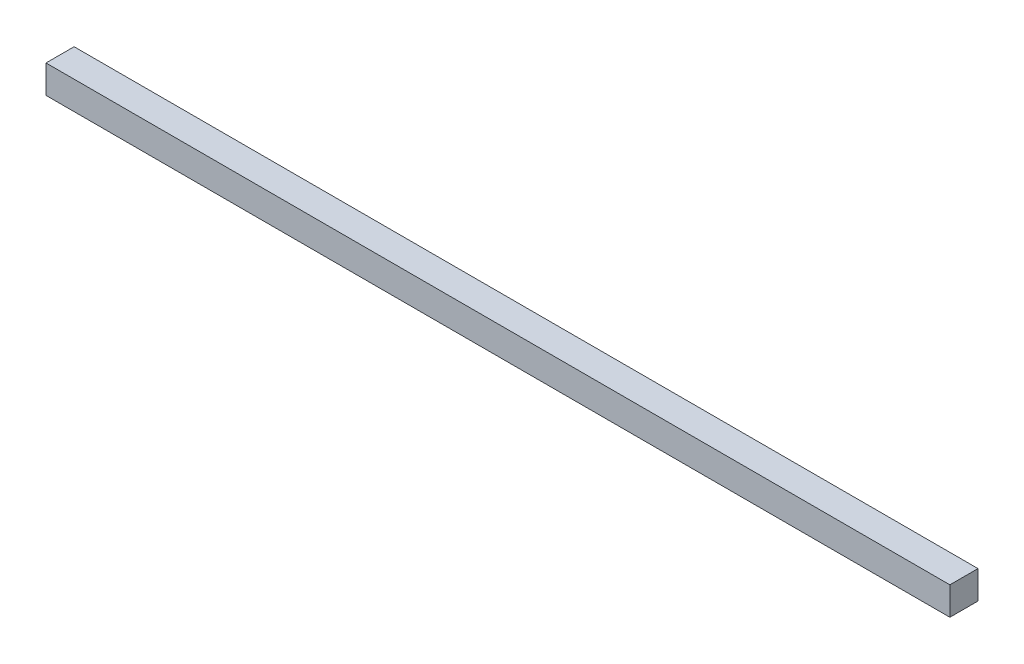
ISO-10303-21;
HEADER;
FILE_DESCRIPTION(('STEP AP214'),'2;1');
FILE_NAME('part.step','',(''),(''),'','','');
FILE_SCHEMA(('AUTOMOTIVE_DESIGN { 1 0 10303 214 1 1 1 1 }'));
ENDSEC;
DATA;
#1=APPLICATION_CONTEXT('core data for automotive mechanical design processes');
#2=APPLICATION_PROTOCOL_DEFINITION('international standard','automotive_design',2000,#1);
#3=PRODUCT_CONTEXT('',#1,'mechanical');
#4=PRODUCT('Part','Part','',(#3));
#5=PRODUCT_RELATED_PRODUCT_CATEGORY('part','',(#4));
#6=PRODUCT_DEFINITION_FORMATION('','',#4);
#7=PRODUCT_DEFINITION_CONTEXT('part definition',#1,'design');
#8=PRODUCT_DEFINITION('design','',#6,#7);
#9=PRODUCT_DEFINITION_SHAPE('','',#8);
#10=(LENGTH_UNIT() NAMED_UNIT(*) SI_UNIT(.MILLI.,.METRE.));
#11=(NAMED_UNIT(*) PLANE_ANGLE_UNIT() SI_UNIT($,.RADIAN.));
#12=(NAMED_UNIT(*) SI_UNIT($,.STERADIAN.) SOLID_ANGLE_UNIT());
#13=UNCERTAINTY_MEASURE_WITH_UNIT(LENGTH_MEASURE(1.E-05),#10,'distance_accuracy_value','');
#14=(GEOMETRIC_REPRESENTATION_CONTEXT(3) GLOBAL_UNCERTAINTY_ASSIGNED_CONTEXT((#13)) GLOBAL_UNIT_ASSIGNED_CONTEXT((#10,
#11,#12)) REPRESENTATION_CONTEXT('',''));
#15=CARTESIAN_POINT('',(0.,0.,0.));
#16=DIRECTION('',(0.,0.,1.));
#17=DIRECTION('',(1.,0.,0.));
#18=AXIS2_PLACEMENT_3D('',#15,#16,#17);
#19=CARTESIAN_POINT('',(306.13985,19.05,9.525));
#20=DIRECTION('',(-1.,0.,0.));
#21=DIRECTION('',(0.,0.,1.));
#22=AXIS2_PLACEMENT_3D('',#19,#20,#21);
#23=PLANE('',#22);
#24=DIRECTION('',(0.,0.,-1.));
#25=VECTOR('',#24,1.);
#26=CARTESIAN_POINT('',(306.13985,0.,9.525));
#27=LINE('',#26,#25);
#28=CARTESIAN_POINT('',(306.13985,0.,9.525));
#29=VERTEX_POINT('',#28);
#30=CARTESIAN_POINT('',(306.13985,0.,-9.525));
#31=VERTEX_POINT('',#30);
#32=EDGE_CURVE('E144',#29,#31,#27,.T.);
#33=ORIENTED_EDGE('',*,*,#32,.T.);
#34=DIRECTION('',(0.,-1.,0.));
#35=VECTOR('',#34,1.);
#36=CARTESIAN_POINT('',(306.13985,19.05,-9.525));
#37=LINE('',#36,#35);
#38=CARTESIAN_POINT('',(306.13985,19.05,-9.525));
#39=VERTEX_POINT('',#38);
#40=EDGE_CURVE('E11',#39,#31,#37,.T.);
#41=ORIENTED_EDGE('',*,*,#40,.F.);
#42=DIRECTION('',(0.,0.,-1.));
#43=VECTOR('',#42,1.);
#44=CARTESIAN_POINT('',(306.13985,19.05,9.525));
#45=LINE('',#44,#43);
#46=CARTESIAN_POINT('',(306.13985,19.05,9.525));
#47=VERTEX_POINT('',#46);
#48=EDGE_CURVE('E145',#47,#39,#45,.T.);
#49=ORIENTED_EDGE('',*,*,#48,.F.);
#50=DIRECTION('',(0.,-1.,0.));
#51=VECTOR('',#50,1.);
#52=CARTESIAN_POINT('',(306.13985,19.05,9.525));
#53=LINE('',#52,#51);
#54=EDGE_CURVE('E151',#47,#29,#53,.T.);
#55=ORIENTED_EDGE('',*,*,#54,.T.);
#56=EDGE_LOOP('',(#33,#41,#49,#55));
#57=FACE_BOUND('',#56,.T.);
#58=ADVANCED_FACE('F33',(#57),#23,.F.);
#59=CARTESIAN_POINT('',(-306.13985,19.05,-9.525));
#60=DIRECTION('',(0.,0.,1.));
#61=DIRECTION('',(1.,0.,0.));
#62=AXIS2_PLACEMENT_3D('',#59,#60,#61);
#63=PLANE('',#62);
#64=DIRECTION('',(-1.,0.,0.));
#65=VECTOR('',#64,1.);
#66=CARTESIAN_POINT('',(-306.13985,0.,-9.525));
#67=LINE('',#66,#65);
#68=CARTESIAN_POINT('',(-306.13985,0.,-9.525));
#69=VERTEX_POINT('',#68);
#70=EDGE_CURVE('E154',#31,#69,#67,.T.);
#71=ORIENTED_EDGE('',*,*,#70,.T.);
#72=DIRECTION('',(0.,-1.,0.));
#73=VECTOR('',#72,1.);
#74=CARTESIAN_POINT('',(-306.13985,19.05,-9.525));
#75=LINE('',#74,#73);
#76=CARTESIAN_POINT('',(-306.13985,19.05,-9.525));
#77=VERTEX_POINT('',#76);
#78=EDGE_CURVE('E41',#77,#69,#75,.T.);
#79=ORIENTED_EDGE('',*,*,#78,.F.);
#80=DIRECTION('',(-1.,0.,0.));
#81=VECTOR('',#80,1.);
#82=CARTESIAN_POINT('',(-306.13985,19.05,-9.525));
#83=LINE('',#82,#81);
#84=EDGE_CURVE('E80',#39,#77,#83,.T.);
#85=ORIENTED_EDGE('',*,*,#84,.F.);
#86=ORIENTED_EDGE('',*,*,#40,.T.);
#87=EDGE_LOOP('',(#71,#79,#85,#86));
#88=FACE_BOUND('',#87,.T.);
#89=ADVANCED_FACE('F177',(#88),#63,.F.);
#90=CARTESIAN_POINT('',(-306.13985,19.05,9.525));
#91=DIRECTION('',(1.,0.,0.));
#92=DIRECTION('',(0.,0.,-1.));
#93=AXIS2_PLACEMENT_3D('',#90,#91,#92);
#94=PLANE('',#93);
#95=DIRECTION('',(0.,0.,1.));
#96=VECTOR('',#95,1.);
#97=CARTESIAN_POINT('',(-306.13985,0.,9.525));
#98=LINE('',#97,#96);
#99=CARTESIAN_POINT('',(-306.13985,0.,9.525));
#100=VERTEX_POINT('',#99);
#101=EDGE_CURVE('E67',#69,#100,#98,.T.);
#102=ORIENTED_EDGE('',*,*,#101,.T.);
#103=DIRECTION('',(0.,-1.,0.));
#104=VECTOR('',#103,1.);
#105=CARTESIAN_POINT('',(-306.13985,19.05,9.525));
#106=LINE('',#105,#104);
#107=CARTESIAN_POINT('',(-306.13985,19.05,9.525));
#108=VERTEX_POINT('',#107);
#109=EDGE_CURVE('E159',#108,#100,#106,.T.);
#110=ORIENTED_EDGE('',*,*,#109,.F.);
#111=DIRECTION('',(0.,0.,1.));
#112=VECTOR('',#111,1.);
#113=CARTESIAN_POINT('',(-306.13985,19.05,9.525));
#114=LINE('',#113,#112);
#115=EDGE_CURVE('E148',#77,#108,#114,.T.);
#116=ORIENTED_EDGE('',*,*,#115,.F.);
#117=ORIENTED_EDGE('',*,*,#78,.T.);
#118=EDGE_LOOP('',(#102,#110,#116,#117));
#119=FACE_BOUND('',#118,.T.);
#120=ADVANCED_FACE('F161',(#119),#94,.F.);
#121=CARTESIAN_POINT('',(-306.13985,19.05,9.525));
#122=DIRECTION('',(0.,0.,-1.));
#123=DIRECTION('',(-1.,0.,0.));
#124=AXIS2_PLACEMENT_3D('',#121,#122,#123);
#125=PLANE('',#124);
#126=DIRECTION('',(1.,0.,0.));
#127=VECTOR('',#126,1.);
#128=CARTESIAN_POINT('',(-306.13985,0.,9.525));
#129=LINE('',#128,#127);
#130=EDGE_CURVE('E73',#100,#29,#129,.T.);
#131=ORIENTED_EDGE('',*,*,#130,.T.);
#132=ORIENTED_EDGE('',*,*,#54,.F.);
#133=DIRECTION('',(1.,0.,0.));
#134=VECTOR('',#133,1.);
#135=CARTESIAN_POINT('',(-306.13985,19.05,9.525));
#136=LINE('',#135,#134);
#137=EDGE_CURVE('E49',#108,#47,#136,.T.);
#138=ORIENTED_EDGE('',*,*,#137,.F.);
#139=ORIENTED_EDGE('',*,*,#109,.T.);
#140=EDGE_LOOP('',(#131,#132,#138,#139));
#141=FACE_BOUND('',#140,.T.);
#142=ADVANCED_FACE('F168',(#141),#125,.F.);
#143=CARTESIAN_POINT('',(0.,19.05,0.));
#144=DIRECTION('',(0.,-1.,0.));
#145=DIRECTION('',(0.,0.,-1.));
#146=AXIS2_PLACEMENT_3D('',#143,#144,#145);
#147=PLANE('',#146);
#148=ORIENTED_EDGE('',*,*,#48,.T.);
#149=ORIENTED_EDGE('',*,*,#84,.T.);
#150=ORIENTED_EDGE('',*,*,#115,.T.);
#151=ORIENTED_EDGE('',*,*,#137,.T.);
#152=EDGE_LOOP('',(#148,#149,#150,#151));
#153=FACE_BOUND('',#152,.T.);
#154=ADVANCED_FACE('F170',(#153),#147,.F.);
#155=CARTESIAN_POINT('',(0.,0.,0.));
#156=DIRECTION('',(0.,-1.,0.));
#157=DIRECTION('',(0.,0.,-1.));
#158=AXIS2_PLACEMENT_3D('',#155,#156,#157);
#159=PLANE('',#158);
#160=CARTESIAN_POINT('',(-254.,0.,0.));
#161=DIRECTION('',(0.,-1.,0.));
#162=DIRECTION('',(0.,0.,-1.));
#163=AXIS2_PLACEMENT_3D('',#160,#161,#162);
#164=CIRCLE('',#163,1.58749999999996);
#165=CARTESIAN_POINT('',(-254.,0.,-1.58750000000001));
#166=VERTEX_POINT('',#165);
#167=EDGE_CURVE('E110',#166,#166,#164,.T.);
#168=ORIENTED_EDGE('',*,*,#167,.F.);
#169=EDGE_LOOP('',(#168));
#170=FACE_BOUND('',#169,.T.);
#171=CARTESIAN_POINT('',(-152.4,0.,0.));
#172=DIRECTION('',(0.,-1.,0.));
#173=DIRECTION('',(0.,0.,-1.));
#174=AXIS2_PLACEMENT_3D('',#171,#172,#173);
#175=CIRCLE('',#174,1.58749999999999);
#176=CARTESIAN_POINT('',(-152.4,0.,-1.58750000000001));
#177=VERTEX_POINT('',#176);
#178=EDGE_CURVE('E109',#177,#177,#175,.T.);
#179=ORIENTED_EDGE('',*,*,#178,.F.);
#180=EDGE_LOOP('',(#179));
#181=FACE_BOUND('',#180,.T.);
#182=CARTESIAN_POINT('',(-50.8,0.,0.));
#183=DIRECTION('',(0.,-1.,0.));
#184=DIRECTION('',(0.,0.,-1.));
#185=AXIS2_PLACEMENT_3D('',#182,#183,#184);
#186=CIRCLE('',#185,1.58749999999999);
#187=CARTESIAN_POINT('',(-50.8,0.,-1.58750000000005));
#188=VERTEX_POINT('',#187);
#189=EDGE_CURVE('E120',#188,#188,#186,.T.);
#190=ORIENTED_EDGE('',*,*,#189,.F.);
#191=EDGE_LOOP('',(#190));
#192=FACE_BOUND('',#191,.T.);
#193=CARTESIAN_POINT('',(50.8,0.,0.));
#194=DIRECTION('',(0.,-1.,0.));
#195=DIRECTION('',(0.,0.,-1.));
#196=AXIS2_PLACEMENT_3D('',#193,#194,#195);
#197=CIRCLE('',#196,1.58749999999999);
#198=CARTESIAN_POINT('',(50.8,0.,-1.58749999999999));
#199=VERTEX_POINT('',#198);
#200=EDGE_CURVE('E126',#199,#199,#197,.T.);
#201=ORIENTED_EDGE('',*,*,#200,.F.);
#202=EDGE_LOOP('',(#201));
#203=FACE_BOUND('',#202,.T.);
#204=CARTESIAN_POINT('',(152.4,0.,0.));
#205=DIRECTION('',(0.,-1.,0.));
#206=DIRECTION('',(0.,0.,-1.));
#207=AXIS2_PLACEMENT_3D('',#204,#205,#206);
#208=CIRCLE('',#207,1.58749999999999);
#209=CARTESIAN_POINT('',(152.4,0.,-1.58749999999997));
#210=VERTEX_POINT('',#209);
#211=EDGE_CURVE('E132',#210,#210,#208,.T.);
#212=ORIENTED_EDGE('',*,*,#211,.F.);
#213=EDGE_LOOP('',(#212));
#214=FACE_BOUND('',#213,.T.);
#215=CARTESIAN_POINT('',(254.,0.,0.));
#216=DIRECTION('',(0.,-1.,0.));
#217=DIRECTION('',(0.,0.,-1.));
#218=AXIS2_PLACEMENT_3D('',#215,#216,#217);
#219=CIRCLE('',#218,1.58749999999996);
#220=CARTESIAN_POINT('',(254.,0.,-1.58749999999995));
#221=VERTEX_POINT('',#220);
#222=EDGE_CURVE('E138',#221,#221,#219,.T.);
#223=ORIENTED_EDGE('',*,*,#222,.F.);
#224=EDGE_LOOP('',(#223));
#225=FACE_BOUND('',#224,.T.);
#226=ORIENTED_EDGE('',*,*,#32,.F.);
#227=ORIENTED_EDGE('',*,*,#130,.F.);
#228=ORIENTED_EDGE('',*,*,#101,.F.);
#229=ORIENTED_EDGE('',*,*,#70,.F.);
#230=EDGE_LOOP('',(#226,#227,#228,#229));
#231=FACE_BOUND('',#230,.T.);
#232=ADVANCED_FACE('F164',(#170,#181,#192,#203,#214,#225,#231),#159,.T.);
#233=CARTESIAN_POINT('',(254.,11.1125,0.));
#234=DIRECTION('',(0.,-1.,0.));
#235=DIRECTION('',(0.,0.,-1.));
#236=AXIS2_PLACEMENT_3D('',#233,#234,#235);
#237=CONICAL_SURFACE('',#236,1.58750000000002,1.02974425867666);
#238=CARTESIAN_POINT('',(254.,12.0663662327063,0.));
#239=VERTEX_POINT('',#238);
#240=VERTEX_LOOP('',#239);
#241=FACE_BOUND('',#240,.T.);
#242=CARTESIAN_POINT('',(254.,11.1125,0.));
#243=DIRECTION('',(0.,-1.,0.));
#244=DIRECTION('',(0.,0.,-1.));
#245=AXIS2_PLACEMENT_3D('',#242,#243,#244);
#246=CIRCLE('',#245,1.58750000000002);
#247=CARTESIAN_POINT('',(254.,11.1125,-1.5875));
#248=VERTEX_POINT('',#247);
#249=EDGE_CURVE('E141',#248,#248,#246,.T.);
#250=ORIENTED_EDGE('',*,*,#249,.T.);
#251=EDGE_LOOP('',(#250));
#252=FACE_BOUND('',#251,.T.);
#253=ADVANCED_FACE('F209',(#241,#252),#237,.F.);
#254=CARTESIAN_POINT('',(254.,0.,0.));
#255=DIRECTION('',(0.,-1.,0.));
#256=DIRECTION('',(0.,0.,-1.));
#257=AXIS2_PLACEMENT_3D('',#254,#255,#256);
#258=CYLINDRICAL_SURFACE('',#257,1.58749999999999);
#259=ORIENTED_EDGE('',*,*,#249,.F.);
#260=EDGE_LOOP('',(#259));
#261=FACE_BOUND('',#260,.T.);
#262=ORIENTED_EDGE('',*,*,#222,.T.);
#263=EDGE_LOOP('',(#262));
#264=FACE_BOUND('',#263,.T.);
#265=ADVANCED_FACE('F216',(#261,#264),#258,.F.);
#266=CARTESIAN_POINT('',(152.4,11.1125,0.));
#267=DIRECTION('',(0.,-1.,0.));
#268=DIRECTION('',(0.,0.,-1.));
#269=AXIS2_PLACEMENT_3D('',#266,#267,#268);
#270=CONICAL_SURFACE('',#269,1.58749999999999,1.02974425867665);
#271=CARTESIAN_POINT('',(152.4,12.0663662327063,0.));
#272=VERTEX_POINT('',#271);
#273=VERTEX_LOOP('',#272);
#274=FACE_BOUND('',#273,.T.);
#275=CARTESIAN_POINT('',(152.4,11.1125,0.));
#276=DIRECTION('',(0.,-1.,0.));
#277=DIRECTION('',(0.,0.,-1.));
#278=AXIS2_PLACEMENT_3D('',#275,#276,#277);
#279=CIRCLE('',#278,1.58749999999999);
#280=CARTESIAN_POINT('',(152.4,11.1125,-1.58749999999997));
#281=VERTEX_POINT('',#280);
#282=EDGE_CURVE('E135',#281,#281,#279,.T.);
#283=ORIENTED_EDGE('',*,*,#282,.T.);
#284=EDGE_LOOP('',(#283));
#285=FACE_BOUND('',#284,.T.);
#286=ADVANCED_FACE('F226',(#274,#285),#270,.F.);
#287=CARTESIAN_POINT('',(152.4,0.,0.));
#288=DIRECTION('',(0.,-1.,0.));
#289=DIRECTION('',(0.,0.,-1.));
#290=AXIS2_PLACEMENT_3D('',#287,#288,#289);
#291=CYLINDRICAL_SURFACE('',#290,1.58749999999999);
#292=ORIENTED_EDGE('',*,*,#282,.F.);
#293=EDGE_LOOP('',(#292));
#294=FACE_BOUND('',#293,.T.);
#295=ORIENTED_EDGE('',*,*,#211,.T.);
#296=EDGE_LOOP('',(#295));
#297=FACE_BOUND('',#296,.T.);
#298=ADVANCED_FACE('F236',(#294,#297),#291,.F.);
#299=CARTESIAN_POINT('',(50.8,11.1125,0.));
#300=DIRECTION('',(0.,-1.,0.));
#301=DIRECTION('',(0.,0.,-1.));
#302=AXIS2_PLACEMENT_3D('',#299,#300,#301);
#303=CONICAL_SURFACE('',#302,1.5875,1.02974425867665);
#304=CARTESIAN_POINT('',(50.8,12.0663662327063,0.));
#305=VERTEX_POINT('',#304);
#306=VERTEX_LOOP('',#305);
#307=FACE_BOUND('',#306,.T.);
#308=CARTESIAN_POINT('',(50.8,11.1125,0.));
#309=DIRECTION('',(0.,-1.,0.));
#310=DIRECTION('',(0.,0.,-1.));
#311=AXIS2_PLACEMENT_3D('',#308,#309,#310);
#312=CIRCLE('',#311,1.5875);
#313=CARTESIAN_POINT('',(50.8,11.1125,-1.5875));
#314=VERTEX_POINT('',#313);
#315=EDGE_CURVE('E129',#314,#314,#312,.T.);
#316=ORIENTED_EDGE('',*,*,#315,.T.);
#317=EDGE_LOOP('',(#316));
#318=FACE_BOUND('',#317,.T.);
#319=ADVANCED_FACE('F246',(#307,#318),#303,.F.);
#320=CARTESIAN_POINT('',(50.8,0.,0.));
#321=DIRECTION('',(0.,-1.,0.));
#322=DIRECTION('',(0.,0.,-1.));
#323=AXIS2_PLACEMENT_3D('',#320,#321,#322);
#324=CYLINDRICAL_SURFACE('',#323,1.5875);
#325=ORIENTED_EDGE('',*,*,#315,.F.);
#326=EDGE_LOOP('',(#325));
#327=FACE_BOUND('',#326,.T.);
#328=ORIENTED_EDGE('',*,*,#200,.T.);
#329=EDGE_LOOP('',(#328));
#330=FACE_BOUND('',#329,.T.);
#331=ADVANCED_FACE('F256',(#327,#330),#324,.F.);
#332=CARTESIAN_POINT('',(-50.8,11.1125,0.));
#333=DIRECTION('',(0.,-1.,0.));
#334=DIRECTION('',(0.,0.,-1.));
#335=AXIS2_PLACEMENT_3D('',#332,#333,#334);
#336=CONICAL_SURFACE('',#335,1.5875,1.02974425867665);
#337=CARTESIAN_POINT('',(-50.8,12.0663662327063,0.));
#338=VERTEX_POINT('',#337);
#339=VERTEX_LOOP('',#338);
#340=FACE_BOUND('',#339,.T.);
#341=CARTESIAN_POINT('',(-50.8,11.1125,0.));
#342=DIRECTION('',(0.,-1.,0.));
#343=DIRECTION('',(0.,0.,-1.));
#344=AXIS2_PLACEMENT_3D('',#341,#342,#343);
#345=CIRCLE('',#344,1.5875);
#346=CARTESIAN_POINT('',(-50.8,11.1125,-1.58750000000006));
#347=VERTEX_POINT('',#346);
#348=EDGE_CURVE('E123',#347,#347,#345,.T.);
#349=ORIENTED_EDGE('',*,*,#348,.T.);
#350=EDGE_LOOP('',(#349));
#351=FACE_BOUND('',#350,.T.);
#352=ADVANCED_FACE('F266',(#340,#351),#336,.F.);
#353=CARTESIAN_POINT('',(-50.8,0.,0.));
#354=DIRECTION('',(0.,-1.,0.));
#355=DIRECTION('',(0.,0.,-1.));
#356=AXIS2_PLACEMENT_3D('',#353,#354,#355);
#357=CYLINDRICAL_SURFACE('',#356,1.5875);
#358=ORIENTED_EDGE('',*,*,#348,.F.);
#359=EDGE_LOOP('',(#358));
#360=FACE_BOUND('',#359,.T.);
#361=ORIENTED_EDGE('',*,*,#189,.T.);
#362=EDGE_LOOP('',(#361));
#363=FACE_BOUND('',#362,.T.);
#364=ADVANCED_FACE('F276',(#360,#363),#357,.F.);
#365=CARTESIAN_POINT('',(-152.4,11.1125,0.));
#366=DIRECTION('',(0.,-1.,0.));
#367=DIRECTION('',(0.,0.,-1.));
#368=AXIS2_PLACEMENT_3D('',#365,#366,#367);
#369=CONICAL_SURFACE('',#368,1.58749999999999,1.02974425867665);
#370=CARTESIAN_POINT('',(-152.4,12.0663662327063,0.));
#371=VERTEX_POINT('',#370);
#372=VERTEX_LOOP('',#371);
#373=FACE_BOUND('',#372,.T.);
#374=CARTESIAN_POINT('',(-152.4,11.1125,0.));
#375=DIRECTION('',(0.,-1.,0.));
#376=DIRECTION('',(0.,0.,-1.));
#377=AXIS2_PLACEMENT_3D('',#374,#375,#376);
#378=CIRCLE('',#377,1.58749999999999);
#379=CARTESIAN_POINT('',(-152.4,11.1125,-1.58750000000001));
#380=VERTEX_POINT('',#379);
#381=EDGE_CURVE('E113',#380,#380,#378,.T.);
#382=ORIENTED_EDGE('',*,*,#381,.T.);
#383=EDGE_LOOP('',(#382));
#384=FACE_BOUND('',#383,.T.);
#385=ADVANCED_FACE('F286',(#373,#384),#369,.F.);
#386=CARTESIAN_POINT('',(-152.4,0.,0.));
#387=DIRECTION('',(0.,-1.,0.));
#388=DIRECTION('',(0.,0.,-1.));
#389=AXIS2_PLACEMENT_3D('',#386,#387,#388);
#390=CYLINDRICAL_SURFACE('',#389,1.58749999999999);
#391=ORIENTED_EDGE('',*,*,#381,.F.);
#392=EDGE_LOOP('',(#391));
#393=FACE_BOUND('',#392,.T.);
#394=ORIENTED_EDGE('',*,*,#178,.T.);
#395=EDGE_LOOP('',(#394));
#396=FACE_BOUND('',#395,.T.);
#397=ADVANCED_FACE('F103',(#393,#396),#390,.F.);
#398=CARTESIAN_POINT('',(-254.,11.1125,0.));
#399=DIRECTION('',(0.,-1.,0.));
#400=DIRECTION('',(0.,0.,-1.));
#401=AXIS2_PLACEMENT_3D('',#398,#399,#400);
#402=CONICAL_SURFACE('',#401,1.58750000000002,1.02974425867666);
#403=CARTESIAN_POINT('',(-254.,12.0663662327063,0.));
#404=VERTEX_POINT('',#403);
#405=VERTEX_LOOP('',#404);
#406=FACE_BOUND('',#405,.T.);
#407=CARTESIAN_POINT('',(-254.,11.1125,0.));
#408=DIRECTION('',(0.,-1.,0.));
#409=DIRECTION('',(0.,0.,-1.));
#410=AXIS2_PLACEMENT_3D('',#407,#408,#409);
#411=CIRCLE('',#410,1.58750000000002);
#412=CARTESIAN_POINT('',(-254.,11.1125,-1.58750000000007));
#413=VERTEX_POINT('',#412);
#414=EDGE_CURVE('E107',#413,#413,#411,.T.);
#415=ORIENTED_EDGE('',*,*,#414,.T.);
#416=EDGE_LOOP('',(#415));
#417=FACE_BOUND('',#416,.T.);
#418=ADVANCED_FACE('F99',(#406,#417),#402,.F.);
#419=CARTESIAN_POINT('',(-254.,0.,0.));
#420=DIRECTION('',(0.,-1.,0.));
#421=DIRECTION('',(0.,0.,-1.));
#422=AXIS2_PLACEMENT_3D('',#419,#420,#421);
#423=CYLINDRICAL_SURFACE('',#422,1.58749999999999);
#424=ORIENTED_EDGE('',*,*,#414,.F.);
#425=EDGE_LOOP('',(#424));
#426=FACE_BOUND('',#425,.T.);
#427=ORIENTED_EDGE('',*,*,#167,.T.);
#428=EDGE_LOOP('',(#427));
#429=FACE_BOUND('',#428,.T.);
#430=ADVANCED_FACE('F102',(#426,#429),#423,.F.);
#431=CLOSED_SHELL('',(#58,#89,#120,#142,#154,#232,#253,#265,#286,#298,#319,#331,#352,#364,#385,
#397,#418,#430));
#432=MANIFOLD_SOLID_BREP('B2',#431);
#433=ADVANCED_BREP_SHAPE_REPRESENTATION('',(#18,#432),#14);
#434=SHAPE_DEFINITION_REPRESENTATION(#9,#433);
ENDSEC;
END-ISO-10303-21;
